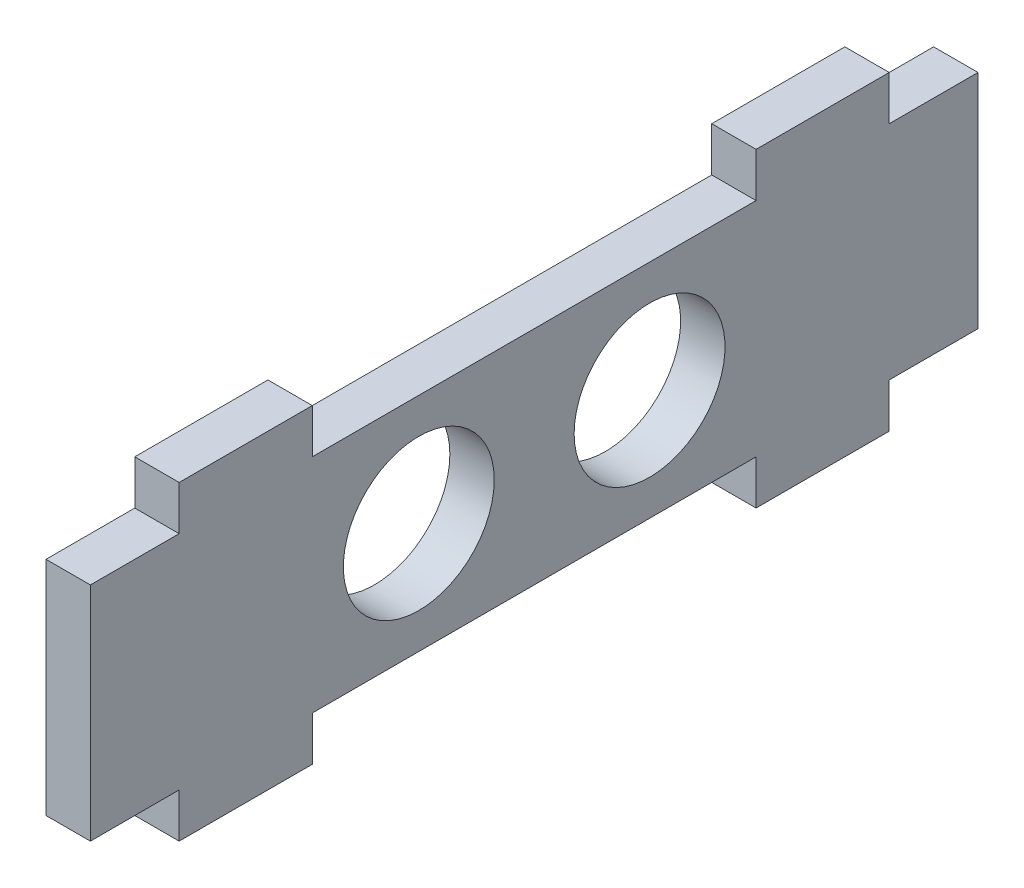
ISO-10303-21;
HEADER;
FILE_DESCRIPTION(('STEP AP214'),'2;1');
FILE_NAME('part.step','',(''),(''),'','','');
FILE_SCHEMA(('AUTOMOTIVE_DESIGN { 1 0 10303 214 1 1 1 1 }'));
ENDSEC;
DATA;
#1=APPLICATION_CONTEXT('core data for automotive mechanical design processes');
#2=APPLICATION_PROTOCOL_DEFINITION('international standard','automotive_design',2000,#1);
#3=PRODUCT_CONTEXT('',#1,'mechanical');
#4=PRODUCT('Part','Part','',(#3));
#5=PRODUCT_RELATED_PRODUCT_CATEGORY('part','',(#4));
#6=PRODUCT_DEFINITION_FORMATION('','',#4);
#7=PRODUCT_DEFINITION_CONTEXT('part definition',#1,'design');
#8=PRODUCT_DEFINITION('design','',#6,#7);
#9=PRODUCT_DEFINITION_SHAPE('','',#8);
#10=(LENGTH_UNIT() NAMED_UNIT(*) SI_UNIT(.MILLI.,.METRE.));
#11=(NAMED_UNIT(*) PLANE_ANGLE_UNIT() SI_UNIT($,.RADIAN.));
#12=(NAMED_UNIT(*) SI_UNIT($,.STERADIAN.) SOLID_ANGLE_UNIT());
#13=UNCERTAINTY_MEASURE_WITH_UNIT(LENGTH_MEASURE(1.E-05),#10,'distance_accuracy_value','');
#14=(GEOMETRIC_REPRESENTATION_CONTEXT(3) GLOBAL_UNCERTAINTY_ASSIGNED_CONTEXT((#13)) GLOBAL_UNIT_ASSIGNED_CONTEXT((#10,
#11,#12)) REPRESENTATION_CONTEXT('',''));
#15=CARTESIAN_POINT('',(0.,0.,0.));
#16=DIRECTION('',(0.,0.,1.));
#17=DIRECTION('',(1.,0.,0.));
#18=AXIS2_PLACEMENT_3D('',#15,#16,#17);
#19=CARTESIAN_POINT('',(5.,0.,0.));
#20=DIRECTION('',(1.,0.,0.));
#21=DIRECTION('',(0.,0.,-1.));
#22=AXIS2_PLACEMENT_3D('',#19,#20,#21);
#23=PLANE('',#22);
#24=CARTESIAN_POINT('',(5.,0.,13.));
#25=DIRECTION('',(1.,0.,0.));
#26=DIRECTION('',(0.,0.,-1.));
#27=AXIS2_PLACEMENT_3D('',#24,#25,#26);
#28=CIRCLE('',#27,8.5);
#29=CARTESIAN_POINT('',(5.,0.,4.5));
#30=VERTEX_POINT('',#29);
#31=EDGE_CURVE('E206',#30,#30,#28,.T.);
#32=ORIENTED_EDGE('',*,*,#31,.F.);
#33=EDGE_LOOP('',(#32));
#34=FACE_BOUND('',#33,.T.);
#35=DIRECTION('',(0.,0.,1.));
#36=VECTOR('',#35,1.);
#37=CARTESIAN_POINT('',(5.,12.5,-40.));
#38=LINE('',#37,#36);
#39=CARTESIAN_POINT('',(5.,12.5,-50.));
#40=VERTEX_POINT('',#39);
#41=CARTESIAN_POINT('',(5.,12.5,-40.));
#42=VERTEX_POINT('',#41);
#43=EDGE_CURVE('E241',#40,#42,#38,.T.);
#44=ORIENTED_EDGE('',*,*,#43,.T.);
#45=DIRECTION('',(0.,1.,0.));
#46=VECTOR('',#45,1.);
#47=CARTESIAN_POINT('',(5.,12.5,-40.));
#48=LINE('',#47,#46);
#49=CARTESIAN_POINT('',(5.,17.5,-40.));
#50=VERTEX_POINT('',#49);
#51=EDGE_CURVE('E129',#42,#50,#48,.T.);
#52=ORIENTED_EDGE('',*,*,#51,.T.);
#53=DIRECTION('',(0.,0.,1.));
#54=VECTOR('',#53,1.);
#55=CARTESIAN_POINT('',(5.,17.5,-40.));
#56=LINE('',#55,#54);
#57=CARTESIAN_POINT('',(5.,17.5,-25.));
#58=VERTEX_POINT('',#57);
#59=EDGE_CURVE('E292',#50,#58,#56,.T.);
#60=ORIENTED_EDGE('',*,*,#59,.T.);
#61=DIRECTION('',(0.,-1.,0.));
#62=VECTOR('',#61,1.);
#63=CARTESIAN_POINT('',(5.,12.5,-25.));
#64=LINE('',#63,#62);
#65=CARTESIAN_POINT('',(5.,12.5,-25.));
#66=VERTEX_POINT('',#65);
#67=EDGE_CURVE('E311',#58,#66,#64,.T.);
#68=ORIENTED_EDGE('',*,*,#67,.T.);
#69=DIRECTION('',(0.,0.,1.));
#70=VECTOR('',#69,1.);
#71=CARTESIAN_POINT('',(5.,12.5,25.));
#72=LINE('',#71,#70);
#73=CARTESIAN_POINT('',(5.,12.5,25.));
#74=VERTEX_POINT('',#73);
#75=EDGE_CURVE('E308',#66,#74,#72,.T.);
#76=ORIENTED_EDGE('',*,*,#75,.T.);
#77=DIRECTION('',(0.,1.,0.));
#78=VECTOR('',#77,1.);
#79=CARTESIAN_POINT('',(5.,12.5,25.));
#80=LINE('',#79,#78);
#81=CARTESIAN_POINT('',(5.,17.5,25.));
#82=VERTEX_POINT('',#81);
#83=EDGE_CURVE('E310',#74,#82,#80,.T.);
#84=ORIENTED_EDGE('',*,*,#83,.T.);
#85=DIRECTION('',(0.,0.,1.));
#86=VECTOR('',#85,1.);
#87=CARTESIAN_POINT('',(5.,17.5,40.));
#88=LINE('',#87,#86);
#89=CARTESIAN_POINT('',(5.,17.5,40.));
#90=VERTEX_POINT('',#89);
#91=EDGE_CURVE('E313',#82,#90,#88,.T.);
#92=ORIENTED_EDGE('',*,*,#91,.T.);
#93=DIRECTION('',(0.,-1.,0.));
#94=VECTOR('',#93,1.);
#95=CARTESIAN_POINT('',(5.,12.5,40.));
#96=LINE('',#95,#94);
#97=CARTESIAN_POINT('',(5.,12.5,40.));
#98=VERTEX_POINT('',#97);
#99=EDGE_CURVE('E319',#90,#98,#96,.T.);
#100=ORIENTED_EDGE('',*,*,#99,.T.);
#101=DIRECTION('',(0.,0.,1.));
#102=VECTOR('',#101,1.);
#103=CARTESIAN_POINT('',(5.,12.5,50.));
#104=LINE('',#103,#102);
#105=CARTESIAN_POINT('',(5.,12.5,50.));
#106=VERTEX_POINT('',#105);
#107=EDGE_CURVE('E321',#98,#106,#104,.T.);
#108=ORIENTED_EDGE('',*,*,#107,.T.);
#109=DIRECTION('',(0.,-1.,0.));
#110=VECTOR('',#109,1.);
#111=CARTESIAN_POINT('',(5.,-12.5,50.));
#112=LINE('',#111,#110);
#113=CARTESIAN_POINT('',(5.,-12.5,50.));
#114=VERTEX_POINT('',#113);
#115=EDGE_CURVE('E323',#106,#114,#112,.T.);
#116=ORIENTED_EDGE('',*,*,#115,.T.);
#117=DIRECTION('',(0.,0.,-1.));
#118=VECTOR('',#117,1.);
#119=CARTESIAN_POINT('',(5.,-12.5,50.));
#120=LINE('',#119,#118);
#121=CARTESIAN_POINT('',(5.,-12.5,40.));
#122=VERTEX_POINT('',#121);
#123=EDGE_CURVE('E325',#114,#122,#120,.T.);
#124=ORIENTED_EDGE('',*,*,#123,.T.);
#125=DIRECTION('',(0.,-1.,0.));
#126=VECTOR('',#125,1.);
#127=CARTESIAN_POINT('',(5.,-12.5,40.));
#128=LINE('',#127,#126);
#129=CARTESIAN_POINT('',(5.,-17.5,40.));
#130=VERTEX_POINT('',#129);
#131=EDGE_CURVE('E327',#122,#130,#128,.T.);
#132=ORIENTED_EDGE('',*,*,#131,.T.);
#133=DIRECTION('',(0.,0.,-1.));
#134=VECTOR('',#133,1.);
#135=CARTESIAN_POINT('',(5.,-17.5,40.));
#136=LINE('',#135,#134);
#137=CARTESIAN_POINT('',(5.,-17.5,25.));
#138=VERTEX_POINT('',#137);
#139=EDGE_CURVE('E329',#130,#138,#136,.T.);
#140=ORIENTED_EDGE('',*,*,#139,.T.);
#141=DIRECTION('',(0.,1.,0.));
#142=VECTOR('',#141,1.);
#143=CARTESIAN_POINT('',(5.,-12.5,25.));
#144=LINE('',#143,#142);
#145=CARTESIAN_POINT('',(5.,-12.5,25.));
#146=VERTEX_POINT('',#145);
#147=EDGE_CURVE('E331',#138,#146,#144,.T.);
#148=ORIENTED_EDGE('',*,*,#147,.T.);
#149=DIRECTION('',(0.,0.,-1.));
#150=VECTOR('',#149,1.);
#151=CARTESIAN_POINT('',(5.,-12.5,25.));
#152=LINE('',#151,#150);
#153=CARTESIAN_POINT('',(5.,-12.5,-25.));
#154=VERTEX_POINT('',#153);
#155=EDGE_CURVE('E333',#146,#154,#152,.T.);
#156=ORIENTED_EDGE('',*,*,#155,.T.);
#157=DIRECTION('',(0.,-1.,0.));
#158=VECTOR('',#157,1.);
#159=CARTESIAN_POINT('',(5.,-12.5,-25.));
#160=LINE('',#159,#158);
#161=CARTESIAN_POINT('',(5.,-17.5,-25.));
#162=VERTEX_POINT('',#161);
#163=EDGE_CURVE('E335',#154,#162,#160,.T.);
#164=ORIENTED_EDGE('',*,*,#163,.T.);
#165=DIRECTION('',(0.,0.,-1.));
#166=VECTOR('',#165,1.);
#167=CARTESIAN_POINT('',(5.,-17.5,-40.));
#168=LINE('',#167,#166);
#169=CARTESIAN_POINT('',(5.,-17.5,-40.));
#170=VERTEX_POINT('',#169);
#171=EDGE_CURVE('E184',#162,#170,#168,.T.);
#172=ORIENTED_EDGE('',*,*,#171,.T.);
#173=DIRECTION('',(0.,1.,0.));
#174=VECTOR('',#173,1.);
#175=CARTESIAN_POINT('',(5.,-12.5,-40.));
#176=LINE('',#175,#174);
#177=CARTESIAN_POINT('',(5.,-12.5,-40.));
#178=VERTEX_POINT('',#177);
#179=EDGE_CURVE('E178',#170,#178,#176,.T.);
#180=ORIENTED_EDGE('',*,*,#179,.T.);
#181=DIRECTION('',(0.,0.,-1.));
#182=VECTOR('',#181,1.);
#183=CARTESIAN_POINT('',(5.,-12.5,-40.));
#184=LINE('',#183,#182);
#185=CARTESIAN_POINT('',(5.,-12.5,-50.));
#186=VERTEX_POINT('',#185);
#187=EDGE_CURVE('E182',#178,#186,#184,.T.);
#188=ORIENTED_EDGE('',*,*,#187,.T.);
#189=DIRECTION('',(0.,1.,0.));
#190=VECTOR('',#189,1.);
#191=CARTESIAN_POINT('',(5.,-12.5,-50.));
#192=LINE('',#191,#190);
#193=EDGE_CURVE('E50',#186,#40,#192,.T.);
#194=ORIENTED_EDGE('',*,*,#193,.T.);
#195=EDGE_LOOP('',(#44,#52,#60,#68,#76,#84,#92,#100,#108,#116,#124,#132,#140,#148,#156,#164,
#172,#180,#188,#194));
#196=FACE_BOUND('',#195,.T.);
#197=CARTESIAN_POINT('',(5.,0.,-13.));
#198=DIRECTION('',(1.,0.,0.));
#199=DIRECTION('',(0.,0.,1.));
#200=AXIS2_PLACEMENT_3D('',#197,#198,#199);
#201=CIRCLE('',#200,8.5);
#202=CARTESIAN_POINT('',(5.,0.,-4.5));
#203=VERTEX_POINT('',#202);
#204=EDGE_CURVE('E377',#203,#203,#201,.T.);
#205=ORIENTED_EDGE('',*,*,#204,.F.);
#206=EDGE_LOOP('',(#205));
#207=FACE_BOUND('',#206,.T.);
#208=ADVANCED_FACE('F33',(#34,#196,#207),#23,.T.);
#209=CARTESIAN_POINT('',(0.,0.,0.));
#210=DIRECTION('',(1.,0.,0.));
#211=DIRECTION('',(0.,0.,-1.));
#212=AXIS2_PLACEMENT_3D('',#209,#210,#211);
#213=PLANE('',#212);
#214=DIRECTION('',(0.,0.,1.));
#215=VECTOR('',#214,1.);
#216=CARTESIAN_POINT('',(0.,12.5,-40.));
#217=LINE('',#216,#215);
#218=CARTESIAN_POINT('',(0.,12.5,-50.));
#219=VERTEX_POINT('',#218);
#220=CARTESIAN_POINT('',(0.,12.5,-40.));
#221=VERTEX_POINT('',#220);
#222=EDGE_CURVE('E202',#219,#221,#217,.T.);
#223=ORIENTED_EDGE('',*,*,#222,.F.);
#224=DIRECTION('',(0.,1.,0.));
#225=VECTOR('',#224,1.);
#226=CARTESIAN_POINT('',(0.,-12.5,-50.));
#227=LINE('',#226,#225);
#228=CARTESIAN_POINT('',(0.,-12.5,-50.));
#229=VERTEX_POINT('',#228);
#230=EDGE_CURVE('E121',#229,#219,#227,.T.);
#231=ORIENTED_EDGE('',*,*,#230,.F.);
#232=DIRECTION('',(0.,0.,-1.));
#233=VECTOR('',#232,1.);
#234=CARTESIAN_POINT('',(0.,-12.5,-40.));
#235=LINE('',#234,#233);
#236=CARTESIAN_POINT('',(0.,-12.5,-40.));
#237=VERTEX_POINT('',#236);
#238=EDGE_CURVE('E115',#237,#229,#235,.T.);
#239=ORIENTED_EDGE('',*,*,#238,.F.);
#240=DIRECTION('',(0.,1.,0.));
#241=VECTOR('',#240,1.);
#242=CARTESIAN_POINT('',(0.,-12.5,-40.));
#243=LINE('',#242,#241);
#244=CARTESIAN_POINT('',(0.,-17.5,-40.));
#245=VERTEX_POINT('',#244);
#246=EDGE_CURVE('E192',#245,#237,#243,.T.);
#247=ORIENTED_EDGE('',*,*,#246,.F.);
#248=DIRECTION('',(0.,0.,-1.));
#249=VECTOR('',#248,1.);
#250=CARTESIAN_POINT('',(0.,-17.5,-40.));
#251=LINE('',#250,#249);
#252=CARTESIAN_POINT('',(0.,-17.5,-25.));
#253=VERTEX_POINT('',#252);
#254=EDGE_CURVE('E236',#253,#245,#251,.T.);
#255=ORIENTED_EDGE('',*,*,#254,.F.);
#256=DIRECTION('',(0.,-1.,0.));
#257=VECTOR('',#256,1.);
#258=CARTESIAN_POINT('',(0.,-12.5,-25.));
#259=LINE('',#258,#257);
#260=CARTESIAN_POINT('',(0.,-12.5,-25.));
#261=VERTEX_POINT('',#260);
#262=EDGE_CURVE('E234',#261,#253,#259,.T.);
#263=ORIENTED_EDGE('',*,*,#262,.F.);
#264=DIRECTION('',(0.,0.,-1.));
#265=VECTOR('',#264,1.);
#266=CARTESIAN_POINT('',(0.,-12.5,25.));
#267=LINE('',#266,#265);
#268=CARTESIAN_POINT('',(0.,-12.5,25.));
#269=VERTEX_POINT('',#268);
#270=EDGE_CURVE('E232',#269,#261,#267,.T.);
#271=ORIENTED_EDGE('',*,*,#270,.F.);
#272=DIRECTION('',(0.,1.,0.));
#273=VECTOR('',#272,1.);
#274=CARTESIAN_POINT('',(0.,-12.5,25.));
#275=LINE('',#274,#273);
#276=CARTESIAN_POINT('',(0.,-17.5,25.));
#277=VERTEX_POINT('',#276);
#278=EDGE_CURVE('E230',#277,#269,#275,.T.);
#279=ORIENTED_EDGE('',*,*,#278,.F.);
#280=DIRECTION('',(0.,0.,-1.));
#281=VECTOR('',#280,1.);
#282=CARTESIAN_POINT('',(0.,-17.5,40.));
#283=LINE('',#282,#281);
#284=CARTESIAN_POINT('',(0.,-17.5,40.));
#285=VERTEX_POINT('',#284);
#286=EDGE_CURVE('E228',#285,#277,#283,.T.);
#287=ORIENTED_EDGE('',*,*,#286,.F.);
#288=DIRECTION('',(0.,-1.,0.));
#289=VECTOR('',#288,1.);
#290=CARTESIAN_POINT('',(0.,-12.5,40.));
#291=LINE('',#290,#289);
#292=CARTESIAN_POINT('',(0.,-12.5,40.));
#293=VERTEX_POINT('',#292);
#294=EDGE_CURVE('E226',#293,#285,#291,.T.);
#295=ORIENTED_EDGE('',*,*,#294,.F.);
#296=DIRECTION('',(0.,0.,-1.));
#297=VECTOR('',#296,1.);
#298=CARTESIAN_POINT('',(0.,-12.5,50.));
#299=LINE('',#298,#297);
#300=CARTESIAN_POINT('',(0.,-12.5,50.));
#301=VERTEX_POINT('',#300);
#302=EDGE_CURVE('E224',#301,#293,#299,.T.);
#303=ORIENTED_EDGE('',*,*,#302,.F.);
#304=DIRECTION('',(0.,-1.,0.));
#305=VECTOR('',#304,1.);
#306=CARTESIAN_POINT('',(0.,-12.5,50.));
#307=LINE('',#306,#305);
#308=CARTESIAN_POINT('',(0.,12.5,50.));
#309=VERTEX_POINT('',#308);
#310=EDGE_CURVE('E222',#309,#301,#307,.T.);
#311=ORIENTED_EDGE('',*,*,#310,.F.);
#312=DIRECTION('',(0.,0.,1.));
#313=VECTOR('',#312,1.);
#314=CARTESIAN_POINT('',(0.,12.5,50.));
#315=LINE('',#314,#313);
#316=CARTESIAN_POINT('',(0.,12.5,40.));
#317=VERTEX_POINT('',#316);
#318=EDGE_CURVE('E220',#317,#309,#315,.T.);
#319=ORIENTED_EDGE('',*,*,#318,.F.);
#320=DIRECTION('',(0.,-1.,0.));
#321=VECTOR('',#320,1.);
#322=CARTESIAN_POINT('',(0.,12.5,40.));
#323=LINE('',#322,#321);
#324=CARTESIAN_POINT('',(0.,17.5,40.));
#325=VERTEX_POINT('',#324);
#326=EDGE_CURVE('E218',#325,#317,#323,.T.);
#327=ORIENTED_EDGE('',*,*,#326,.F.);
#328=DIRECTION('',(0.,0.,1.));
#329=VECTOR('',#328,1.);
#330=CARTESIAN_POINT('',(0.,17.5,40.));
#331=LINE('',#330,#329);
#332=CARTESIAN_POINT('',(0.,17.5,25.));
#333=VERTEX_POINT('',#332);
#334=EDGE_CURVE('E216',#333,#325,#331,.T.);
#335=ORIENTED_EDGE('',*,*,#334,.F.);
#336=DIRECTION('',(0.,1.,0.));
#337=VECTOR('',#336,1.);
#338=CARTESIAN_POINT('',(0.,12.5,25.));
#339=LINE('',#338,#337);
#340=CARTESIAN_POINT('',(0.,12.5,25.));
#341=VERTEX_POINT('',#340);
#342=EDGE_CURVE('E214',#341,#333,#339,.T.);
#343=ORIENTED_EDGE('',*,*,#342,.F.);
#344=DIRECTION('',(0.,0.,1.));
#345=VECTOR('',#344,1.);
#346=CARTESIAN_POINT('',(0.,12.5,25.));
#347=LINE('',#346,#345);
#348=CARTESIAN_POINT('',(0.,12.5,-25.));
#349=VERTEX_POINT('',#348);
#350=EDGE_CURVE('E212',#349,#341,#347,.T.);
#351=ORIENTED_EDGE('',*,*,#350,.F.);
#352=DIRECTION('',(0.,-1.,0.));
#353=VECTOR('',#352,1.);
#354=CARTESIAN_POINT('',(0.,12.5,-25.));
#355=LINE('',#354,#353);
#356=CARTESIAN_POINT('',(0.,17.5,-25.));
#357=VERTEX_POINT('',#356);
#358=EDGE_CURVE('E210',#357,#349,#355,.T.);
#359=ORIENTED_EDGE('',*,*,#358,.F.);
#360=DIRECTION('',(0.,0.,1.));
#361=VECTOR('',#360,1.);
#362=CARTESIAN_POINT('',(0.,17.5,-40.));
#363=LINE('',#362,#361);
#364=CARTESIAN_POINT('',(0.,17.5,-40.));
#365=VERTEX_POINT('',#364);
#366=EDGE_CURVE('E208',#365,#357,#363,.T.);
#367=ORIENTED_EDGE('',*,*,#366,.F.);
#368=DIRECTION('',(0.,1.,0.));
#369=VECTOR('',#368,1.);
#370=CARTESIAN_POINT('',(0.,12.5,-40.));
#371=LINE('',#370,#369);
#372=EDGE_CURVE('E205',#221,#365,#371,.T.);
#373=ORIENTED_EDGE('',*,*,#372,.F.);
#374=EDGE_LOOP('',(#223,#231,#239,#247,#255,#263,#271,#279,#287,#295,#303,#311,#319,#327,#335,
#343,#351,#359,#367,#373));
#375=FACE_BOUND('',#374,.T.);
#376=CARTESIAN_POINT('',(0.,0.,13.));
#377=DIRECTION('',(1.,0.,0.));
#378=DIRECTION('',(0.,0.,-1.));
#379=AXIS2_PLACEMENT_3D('',#376,#377,#378);
#380=CIRCLE('',#379,8.5);
#381=CARTESIAN_POINT('',(0.,0.,4.5));
#382=VERTEX_POINT('',#381);
#383=EDGE_CURVE('E383',#382,#382,#380,.T.);
#384=ORIENTED_EDGE('',*,*,#383,.T.);
#385=EDGE_LOOP('',(#384));
#386=FACE_BOUND('',#385,.T.);
#387=CARTESIAN_POINT('',(0.,0.,-13.));
#388=DIRECTION('',(1.,0.,0.));
#389=DIRECTION('',(0.,0.,1.));
#390=AXIS2_PLACEMENT_3D('',#387,#388,#389);
#391=CIRCLE('',#390,8.5);
#392=CARTESIAN_POINT('',(0.,0.,-4.5));
#393=VERTEX_POINT('',#392);
#394=EDGE_CURVE('E380',#393,#393,#391,.T.);
#395=ORIENTED_EDGE('',*,*,#394,.T.);
#396=EDGE_LOOP('',(#395));
#397=FACE_BOUND('',#396,.T.);
#398=ADVANCED_FACE('F296',(#375,#386,#397),#213,.F.);
#399=CARTESIAN_POINT('',(5.,12.5,-40.));
#400=DIRECTION('',(0.,-1.,0.));
#401=DIRECTION('',(0.,0.,-1.));
#402=AXIS2_PLACEMENT_3D('',#399,#400,#401);
#403=PLANE('',#402);
#404=ORIENTED_EDGE('',*,*,#222,.T.);
#405=DIRECTION('',(-1.,0.,0.));
#406=VECTOR('',#405,1.);
#407=CARTESIAN_POINT('',(5.,12.5,-40.));
#408=LINE('',#407,#406);
#409=EDGE_CURVE('E11',#42,#221,#408,.T.);
#410=ORIENTED_EDGE('',*,*,#409,.F.);
#411=ORIENTED_EDGE('',*,*,#43,.F.);
#412=DIRECTION('',(-1.,0.,0.));
#413=VECTOR('',#412,1.);
#414=CARTESIAN_POINT('',(5.,12.5,-50.));
#415=LINE('',#414,#413);
#416=EDGE_CURVE('E198',#40,#219,#415,.T.);
#417=ORIENTED_EDGE('',*,*,#416,.T.);
#418=EDGE_LOOP('',(#404,#410,#411,#417));
#419=FACE_BOUND('',#418,.T.);
#420=ADVANCED_FACE('F35',(#419),#403,.F.);
#421=CARTESIAN_POINT('',(5.,12.5,-40.));
#422=DIRECTION('',(0.,0.,1.));
#423=DIRECTION('',(1.,0.,0.));
#424=AXIS2_PLACEMENT_3D('',#421,#422,#423);
#425=PLANE('',#424);
#426=ORIENTED_EDGE('',*,*,#372,.T.);
#427=DIRECTION('',(-1.,0.,0.));
#428=VECTOR('',#427,1.);
#429=CARTESIAN_POINT('',(5.,17.5,-40.));
#430=LINE('',#429,#428);
#431=EDGE_CURVE('E42',#50,#365,#430,.T.);
#432=ORIENTED_EDGE('',*,*,#431,.F.);
#433=ORIENTED_EDGE('',*,*,#51,.F.);
#434=ORIENTED_EDGE('',*,*,#409,.T.);
#435=EDGE_LOOP('',(#426,#432,#433,#434));
#436=FACE_BOUND('',#435,.T.);
#437=ADVANCED_FACE('F556',(#436),#425,.F.);
#438=CARTESIAN_POINT('',(5.,17.5,-40.));
#439=DIRECTION('',(0.,-1.,0.));
#440=DIRECTION('',(0.,0.,-1.));
#441=AXIS2_PLACEMENT_3D('',#438,#439,#440);
#442=PLANE('',#441);
#443=ORIENTED_EDGE('',*,*,#366,.T.);
#444=DIRECTION('',(-1.,0.,0.));
#445=VECTOR('',#444,1.);
#446=CARTESIAN_POINT('',(5.,17.5,-25.));
#447=LINE('',#446,#445);
#448=EDGE_CURVE('E284',#58,#357,#447,.T.);
#449=ORIENTED_EDGE('',*,*,#448,.F.);
#450=ORIENTED_EDGE('',*,*,#59,.F.);
#451=ORIENTED_EDGE('',*,*,#431,.T.);
#452=EDGE_LOOP('',(#443,#449,#450,#451));
#453=FACE_BOUND('',#452,.T.);
#454=ADVANCED_FACE('F290',(#453),#442,.F.);
#455=CARTESIAN_POINT('',(5.,12.5,-25.));
#456=DIRECTION('',(0.,0.,-1.));
#457=DIRECTION('',(-1.,0.,0.));
#458=AXIS2_PLACEMENT_3D('',#455,#456,#457);
#459=PLANE('',#458);
#460=ORIENTED_EDGE('',*,*,#358,.T.);
#461=DIRECTION('',(-1.,0.,0.));
#462=VECTOR('',#461,1.);
#463=CARTESIAN_POINT('',(5.,12.5,-25.));
#464=LINE('',#463,#462);
#465=EDGE_CURVE('E281',#66,#349,#464,.T.);
#466=ORIENTED_EDGE('',*,*,#465,.F.);
#467=ORIENTED_EDGE('',*,*,#67,.F.);
#468=ORIENTED_EDGE('',*,*,#448,.T.);
#469=EDGE_LOOP('',(#460,#466,#467,#468));
#470=FACE_BOUND('',#469,.T.);
#471=ADVANCED_FACE('F302',(#470),#459,.F.);
#472=CARTESIAN_POINT('',(5.,12.5,25.));
#473=DIRECTION('',(0.,-1.,0.));
#474=DIRECTION('',(0.,0.,-1.));
#475=AXIS2_PLACEMENT_3D('',#472,#473,#474);
#476=PLANE('',#475);
#477=ORIENTED_EDGE('',*,*,#350,.T.);
#478=DIRECTION('',(-1.,0.,0.));
#479=VECTOR('',#478,1.);
#480=CARTESIAN_POINT('',(5.,12.5,25.));
#481=LINE('',#480,#479);
#482=EDGE_CURVE('E278',#74,#341,#481,.T.);
#483=ORIENTED_EDGE('',*,*,#482,.F.);
#484=ORIENTED_EDGE('',*,*,#75,.F.);
#485=ORIENTED_EDGE('',*,*,#465,.T.);
#486=EDGE_LOOP('',(#477,#483,#484,#485));
#487=FACE_BOUND('',#486,.T.);
#488=ADVANCED_FACE('F306',(#487),#476,.F.);
#489=CARTESIAN_POINT('',(5.,12.5,25.));
#490=DIRECTION('',(0.,0.,1.));
#491=DIRECTION('',(1.,0.,0.));
#492=AXIS2_PLACEMENT_3D('',#489,#490,#491);
#493=PLANE('',#492);
#494=ORIENTED_EDGE('',*,*,#342,.T.);
#495=DIRECTION('',(-1.,0.,0.));
#496=VECTOR('',#495,1.);
#497=CARTESIAN_POINT('',(5.,17.5,25.));
#498=LINE('',#497,#496);
#499=EDGE_CURVE('E275',#82,#333,#498,.T.);
#500=ORIENTED_EDGE('',*,*,#499,.F.);
#501=ORIENTED_EDGE('',*,*,#83,.F.);
#502=ORIENTED_EDGE('',*,*,#482,.T.);
#503=EDGE_LOOP('',(#494,#500,#501,#502));
#504=FACE_BOUND('',#503,.T.);
#505=ADVANCED_FACE('F521',(#504),#493,.F.);
#506=CARTESIAN_POINT('',(5.,17.5,40.));
#507=DIRECTION('',(0.,-1.,0.));
#508=DIRECTION('',(0.,0.,-1.));
#509=AXIS2_PLACEMENT_3D('',#506,#507,#508);
#510=PLANE('',#509);
#511=ORIENTED_EDGE('',*,*,#334,.T.);
#512=DIRECTION('',(-1.,0.,0.));
#513=VECTOR('',#512,1.);
#514=CARTESIAN_POINT('',(5.,17.5,40.));
#515=LINE('',#514,#513);
#516=EDGE_CURVE('E272',#90,#325,#515,.T.);
#517=ORIENTED_EDGE('',*,*,#516,.F.);
#518=ORIENTED_EDGE('',*,*,#91,.F.);
#519=ORIENTED_EDGE('',*,*,#499,.T.);
#520=EDGE_LOOP('',(#511,#517,#518,#519));
#521=FACE_BOUND('',#520,.T.);
#522=ADVANCED_FACE('F511',(#521),#510,.F.);
#523=CARTESIAN_POINT('',(5.,12.5,40.));
#524=DIRECTION('',(0.,0.,-1.));
#525=DIRECTION('',(-1.,0.,0.));
#526=AXIS2_PLACEMENT_3D('',#523,#524,#525);
#527=PLANE('',#526);
#528=ORIENTED_EDGE('',*,*,#326,.T.);
#529=DIRECTION('',(-1.,0.,0.));
#530=VECTOR('',#529,1.);
#531=CARTESIAN_POINT('',(5.,12.5,40.));
#532=LINE('',#531,#530);
#533=EDGE_CURVE('E269',#98,#317,#532,.T.);
#534=ORIENTED_EDGE('',*,*,#533,.F.);
#535=ORIENTED_EDGE('',*,*,#99,.F.);
#536=ORIENTED_EDGE('',*,*,#516,.T.);
#537=EDGE_LOOP('',(#528,#534,#535,#536));
#538=FACE_BOUND('',#537,.T.);
#539=ADVANCED_FACE('F501',(#538),#527,.F.);
#540=CARTESIAN_POINT('',(5.,12.5,50.));
#541=DIRECTION('',(0.,-1.,0.));
#542=DIRECTION('',(0.,0.,-1.));
#543=AXIS2_PLACEMENT_3D('',#540,#541,#542);
#544=PLANE('',#543);
#545=ORIENTED_EDGE('',*,*,#318,.T.);
#546=DIRECTION('',(-1.,0.,0.));
#547=VECTOR('',#546,1.);
#548=CARTESIAN_POINT('',(5.,12.5,50.));
#549=LINE('',#548,#547);
#550=EDGE_CURVE('E266',#106,#309,#549,.T.);
#551=ORIENTED_EDGE('',*,*,#550,.F.);
#552=ORIENTED_EDGE('',*,*,#107,.F.);
#553=ORIENTED_EDGE('',*,*,#533,.T.);
#554=EDGE_LOOP('',(#545,#551,#552,#553));
#555=FACE_BOUND('',#554,.T.);
#556=ADVANCED_FACE('F491',(#555),#544,.F.);
#557=CARTESIAN_POINT('',(5.,-12.5,50.));
#558=DIRECTION('',(0.,0.,-1.));
#559=DIRECTION('',(-1.,0.,0.));
#560=AXIS2_PLACEMENT_3D('',#557,#558,#559);
#561=PLANE('',#560);
#562=ORIENTED_EDGE('',*,*,#310,.T.);
#563=DIRECTION('',(-1.,0.,0.));
#564=VECTOR('',#563,1.);
#565=CARTESIAN_POINT('',(5.,-12.5,50.));
#566=LINE('',#565,#564);
#567=EDGE_CURVE('E263',#114,#301,#566,.T.);
#568=ORIENTED_EDGE('',*,*,#567,.F.);
#569=ORIENTED_EDGE('',*,*,#115,.F.);
#570=ORIENTED_EDGE('',*,*,#550,.T.);
#571=EDGE_LOOP('',(#562,#568,#569,#570));
#572=FACE_BOUND('',#571,.T.);
#573=ADVANCED_FACE('F481',(#572),#561,.F.);
#574=CARTESIAN_POINT('',(5.,-12.5,50.));
#575=DIRECTION('',(0.,1.,0.));
#576=DIRECTION('',(0.,0.,1.));
#577=AXIS2_PLACEMENT_3D('',#574,#575,#576);
#578=PLANE('',#577);
#579=ORIENTED_EDGE('',*,*,#302,.T.);
#580=DIRECTION('',(-1.,0.,0.));
#581=VECTOR('',#580,1.);
#582=CARTESIAN_POINT('',(5.,-12.5,40.));
#583=LINE('',#582,#581);
#584=EDGE_CURVE('E260',#122,#293,#583,.T.);
#585=ORIENTED_EDGE('',*,*,#584,.F.);
#586=ORIENTED_EDGE('',*,*,#123,.F.);
#587=ORIENTED_EDGE('',*,*,#567,.T.);
#588=EDGE_LOOP('',(#579,#585,#586,#587));
#589=FACE_BOUND('',#588,.T.);
#590=ADVANCED_FACE('F471',(#589),#578,.F.);
#591=CARTESIAN_POINT('',(5.,-12.5,40.));
#592=DIRECTION('',(0.,0.,-1.));
#593=DIRECTION('',(-1.,0.,0.));
#594=AXIS2_PLACEMENT_3D('',#591,#592,#593);
#595=PLANE('',#594);
#596=ORIENTED_EDGE('',*,*,#294,.T.);
#597=DIRECTION('',(-1.,0.,0.));
#598=VECTOR('',#597,1.);
#599=CARTESIAN_POINT('',(5.,-17.5,40.));
#600=LINE('',#599,#598);
#601=EDGE_CURVE('E257',#130,#285,#600,.T.);
#602=ORIENTED_EDGE('',*,*,#601,.F.);
#603=ORIENTED_EDGE('',*,*,#131,.F.);
#604=ORIENTED_EDGE('',*,*,#584,.T.);
#605=EDGE_LOOP('',(#596,#602,#603,#604));
#606=FACE_BOUND('',#605,.T.);
#607=ADVANCED_FACE('F461',(#606),#595,.F.);
#608=CARTESIAN_POINT('',(5.,-17.5,40.));
#609=DIRECTION('',(0.,1.,0.));
#610=DIRECTION('',(0.,0.,1.));
#611=AXIS2_PLACEMENT_3D('',#608,#609,#610);
#612=PLANE('',#611);
#613=ORIENTED_EDGE('',*,*,#286,.T.);
#614=DIRECTION('',(-1.,0.,0.));
#615=VECTOR('',#614,1.);
#616=CARTESIAN_POINT('',(5.,-17.5,25.));
#617=LINE('',#616,#615);
#618=EDGE_CURVE('E254',#138,#277,#617,.T.);
#619=ORIENTED_EDGE('',*,*,#618,.F.);
#620=ORIENTED_EDGE('',*,*,#139,.F.);
#621=ORIENTED_EDGE('',*,*,#601,.T.);
#622=EDGE_LOOP('',(#613,#619,#620,#621));
#623=FACE_BOUND('',#622,.T.);
#624=ADVANCED_FACE('F451',(#623),#612,.F.);
#625=CARTESIAN_POINT('',(5.,-12.5,25.));
#626=DIRECTION('',(0.,0.,1.));
#627=DIRECTION('',(1.,0.,0.));
#628=AXIS2_PLACEMENT_3D('',#625,#626,#627);
#629=PLANE('',#628);
#630=ORIENTED_EDGE('',*,*,#278,.T.);
#631=DIRECTION('',(-1.,0.,0.));
#632=VECTOR('',#631,1.);
#633=CARTESIAN_POINT('',(5.,-12.5,25.));
#634=LINE('',#633,#632);
#635=EDGE_CURVE('E251',#146,#269,#634,.T.);
#636=ORIENTED_EDGE('',*,*,#635,.F.);
#637=ORIENTED_EDGE('',*,*,#147,.F.);
#638=ORIENTED_EDGE('',*,*,#618,.T.);
#639=EDGE_LOOP('',(#630,#636,#637,#638));
#640=FACE_BOUND('',#639,.T.);
#641=ADVANCED_FACE('F441',(#640),#629,.F.);
#642=CARTESIAN_POINT('',(5.,-12.5,25.));
#643=DIRECTION('',(0.,1.,0.));
#644=DIRECTION('',(0.,0.,1.));
#645=AXIS2_PLACEMENT_3D('',#642,#643,#644);
#646=PLANE('',#645);
#647=ORIENTED_EDGE('',*,*,#270,.T.);
#648=DIRECTION('',(-1.,0.,0.));
#649=VECTOR('',#648,1.);
#650=CARTESIAN_POINT('',(5.,-12.5,-25.));
#651=LINE('',#650,#649);
#652=EDGE_CURVE('E248',#154,#261,#651,.T.);
#653=ORIENTED_EDGE('',*,*,#652,.F.);
#654=ORIENTED_EDGE('',*,*,#155,.F.);
#655=ORIENTED_EDGE('',*,*,#635,.T.);
#656=EDGE_LOOP('',(#647,#653,#654,#655));
#657=FACE_BOUND('',#656,.T.);
#658=ADVANCED_FACE('F432',(#657),#646,.F.);
#659=CARTESIAN_POINT('',(5.,-12.5,-25.));
#660=DIRECTION('',(0.,0.,-1.));
#661=DIRECTION('',(-1.,0.,0.));
#662=AXIS2_PLACEMENT_3D('',#659,#660,#661);
#663=PLANE('',#662);
#664=ORIENTED_EDGE('',*,*,#262,.T.);
#665=DIRECTION('',(-1.,0.,0.));
#666=VECTOR('',#665,1.);
#667=CARTESIAN_POINT('',(5.,-17.5,-25.));
#668=LINE('',#667,#666);
#669=EDGE_CURVE('E245',#162,#253,#668,.T.);
#670=ORIENTED_EDGE('',*,*,#669,.F.);
#671=ORIENTED_EDGE('',*,*,#163,.F.);
#672=ORIENTED_EDGE('',*,*,#652,.T.);
#673=EDGE_LOOP('',(#664,#670,#671,#672));
#674=FACE_BOUND('',#673,.T.);
#675=ADVANCED_FACE('F341',(#674),#663,.F.);
#676=CARTESIAN_POINT('',(5.,-17.5,-40.));
#677=DIRECTION('',(0.,1.,0.));
#678=DIRECTION('',(0.,0.,1.));
#679=AXIS2_PLACEMENT_3D('',#676,#677,#678);
#680=PLANE('',#679);
#681=ORIENTED_EDGE('',*,*,#254,.T.);
#682=DIRECTION('',(-1.,0.,0.));
#683=VECTOR('',#682,1.);
#684=CARTESIAN_POINT('',(5.,-17.5,-40.));
#685=LINE('',#684,#683);
#686=EDGE_CURVE('E193',#170,#245,#685,.T.);
#687=ORIENTED_EDGE('',*,*,#686,.F.);
#688=ORIENTED_EDGE('',*,*,#171,.F.);
#689=ORIENTED_EDGE('',*,*,#669,.T.);
#690=EDGE_LOOP('',(#681,#687,#688,#689));
#691=FACE_BOUND('',#690,.T.);
#692=ADVANCED_FACE('F345',(#691),#680,.F.);
#693=CARTESIAN_POINT('',(5.,-12.5,-40.));
#694=DIRECTION('',(0.,0.,1.));
#695=DIRECTION('',(1.,0.,0.));
#696=AXIS2_PLACEMENT_3D('',#693,#694,#695);
#697=PLANE('',#696);
#698=ORIENTED_EDGE('',*,*,#246,.T.);
#699=DIRECTION('',(-1.,0.,0.));
#700=VECTOR('',#699,1.);
#701=CARTESIAN_POINT('',(5.,-12.5,-40.));
#702=LINE('',#701,#700);
#703=EDGE_CURVE('E189',#178,#237,#702,.T.);
#704=ORIENTED_EDGE('',*,*,#703,.F.);
#705=ORIENTED_EDGE('',*,*,#179,.F.);
#706=ORIENTED_EDGE('',*,*,#686,.T.);
#707=EDGE_LOOP('',(#698,#704,#705,#706));
#708=FACE_BOUND('',#707,.T.);
#709=ADVANCED_FACE('F190',(#708),#697,.F.);
#710=CARTESIAN_POINT('',(5.,-12.5,-40.));
#711=DIRECTION('',(0.,1.,0.));
#712=DIRECTION('',(0.,0.,1.));
#713=AXIS2_PLACEMENT_3D('',#710,#711,#712);
#714=PLANE('',#713);
#715=ORIENTED_EDGE('',*,*,#238,.T.);
#716=DIRECTION('',(-1.,0.,0.));
#717=VECTOR('',#716,1.);
#718=CARTESIAN_POINT('',(5.,-12.5,-50.));
#719=LINE('',#718,#717);
#720=EDGE_CURVE('E194',#186,#229,#719,.T.);
#721=ORIENTED_EDGE('',*,*,#720,.F.);
#722=ORIENTED_EDGE('',*,*,#187,.F.);
#723=ORIENTED_EDGE('',*,*,#703,.T.);
#724=EDGE_LOOP('',(#715,#721,#722,#723));
#725=FACE_BOUND('',#724,.T.);
#726=ADVANCED_FACE('F196',(#725),#714,.F.);
#727=CARTESIAN_POINT('',(5.,-12.5,-50.));
#728=DIRECTION('',(0.,0.,1.));
#729=DIRECTION('',(1.,0.,0.));
#730=AXIS2_PLACEMENT_3D('',#727,#728,#729);
#731=PLANE('',#730);
#732=ORIENTED_EDGE('',*,*,#230,.T.);
#733=ORIENTED_EDGE('',*,*,#416,.F.);
#734=ORIENTED_EDGE('',*,*,#193,.F.);
#735=ORIENTED_EDGE('',*,*,#720,.T.);
#736=EDGE_LOOP('',(#732,#733,#734,#735));
#737=FACE_BOUND('',#736,.T.);
#738=ADVANCED_FACE('F349',(#737),#731,.F.);
#739=CARTESIAN_POINT('',(5.,0.,13.));
#740=DIRECTION('',(-1.,0.,0.));
#741=DIRECTION('',(0.,0.,1.));
#742=AXIS2_PLACEMENT_3D('',#739,#740,#741);
#743=CYLINDRICAL_SURFACE('',#742,8.5);
#744=ORIENTED_EDGE('',*,*,#31,.T.);
#745=EDGE_LOOP('',(#744));
#746=FACE_BOUND('',#745,.T.);
#747=ORIENTED_EDGE('',*,*,#383,.F.);
#748=EDGE_LOOP('',(#747));
#749=FACE_BOUND('',#748,.T.);
#750=ADVANCED_FACE('F351',(#746,#749),#743,.F.);
#751=CARTESIAN_POINT('',(5.,0.,-13.));
#752=DIRECTION('',(-1.,0.,0.));
#753=DIRECTION('',(0.,0.,1.));
#754=AXIS2_PLACEMENT_3D('',#751,#752,#753);
#755=CYLINDRICAL_SURFACE('',#754,8.5);
#756=ORIENTED_EDGE('',*,*,#204,.T.);
#757=EDGE_LOOP('',(#756));
#758=FACE_BOUND('',#757,.T.);
#759=ORIENTED_EDGE('',*,*,#394,.F.);
#760=EDGE_LOOP('',(#759));
#761=FACE_BOUND('',#760,.T.);
#762=ADVANCED_FACE('F357',(#758,#761),#755,.F.);
#763=CLOSED_SHELL('',(#208,#398,#420,#437,#454,#471,#488,#505,#522,#539,#556,#573,#590,#607,
#624,#641,#658,#675,#692,#709,#726,#738,#750,#762));
#764=MANIFOLD_SOLID_BREP('B2',#763);
#765=ADVANCED_BREP_SHAPE_REPRESENTATION('',(#18,#764),#14);
#766=SHAPE_DEFINITION_REPRESENTATION(#9,#765);
ENDSEC;
END-ISO-10303-21;
